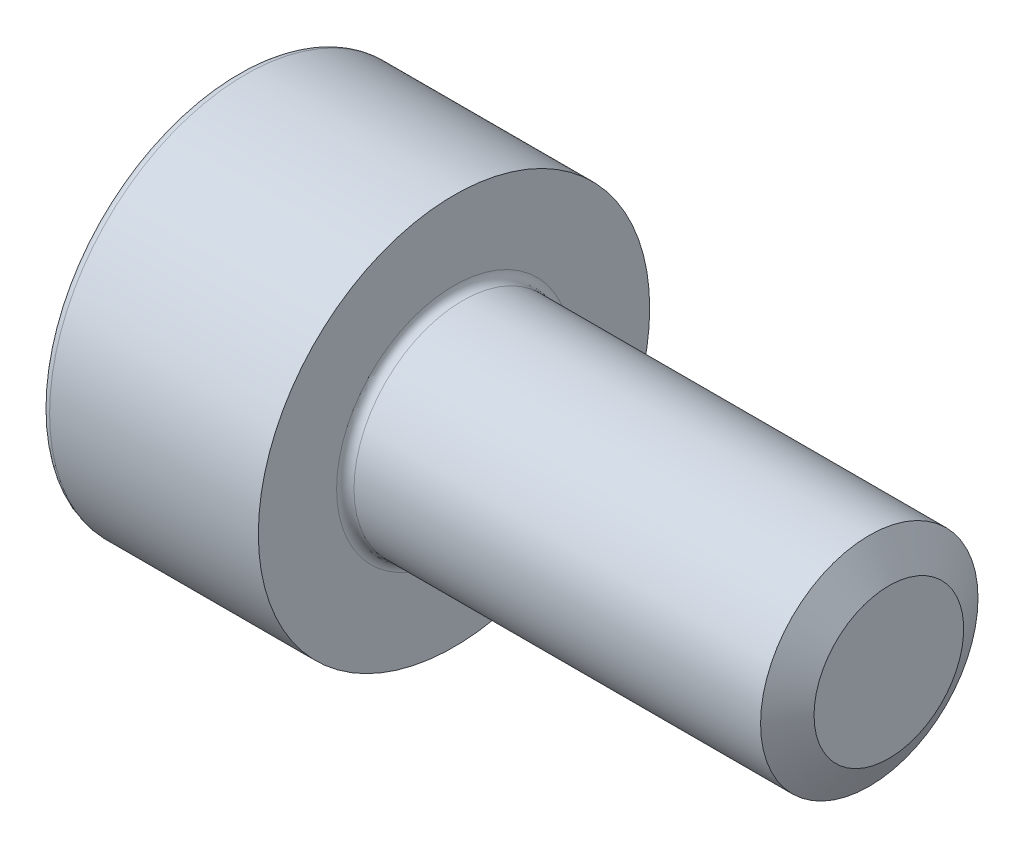
ISO-10303-21;
HEADER;
FILE_DESCRIPTION(('STEP AP214'),'2;1');
FILE_NAME('part.step','',(''),(''),'','','');
FILE_SCHEMA(('AUTOMOTIVE_DESIGN { 1 0 10303 214 1 1 1 1 }'));
ENDSEC;
DATA;
#1=APPLICATION_CONTEXT('core data for automotive mechanical design processes');
#2=APPLICATION_PROTOCOL_DEFINITION('international standard','automotive_design',2000,#1);
#3=PRODUCT_CONTEXT('',#1,'mechanical');
#4=PRODUCT('Part','Part','',(#3));
#5=PRODUCT_RELATED_PRODUCT_CATEGORY('part','',(#4));
#6=PRODUCT_DEFINITION_FORMATION('','',#4);
#7=PRODUCT_DEFINITION_CONTEXT('part definition',#1,'design');
#8=PRODUCT_DEFINITION('design','',#6,#7);
#9=PRODUCT_DEFINITION_SHAPE('','',#8);
#10=(LENGTH_UNIT() NAMED_UNIT(*) SI_UNIT(.MILLI.,.METRE.));
#11=(NAMED_UNIT(*) PLANE_ANGLE_UNIT() SI_UNIT($,.RADIAN.));
#12=(NAMED_UNIT(*) SI_UNIT($,.STERADIAN.) SOLID_ANGLE_UNIT());
#13=UNCERTAINTY_MEASURE_WITH_UNIT(LENGTH_MEASURE(1.E-05),#10,'distance_accuracy_value','');
#14=(GEOMETRIC_REPRESENTATION_CONTEXT(3) GLOBAL_UNCERTAINTY_ASSIGNED_CONTEXT((#13)) GLOBAL_UNIT_ASSIGNED_CONTEXT((#10,
#11,#12)) REPRESENTATION_CONTEXT('',''));
#15=CARTESIAN_POINT('',(0.,0.,0.));
#16=DIRECTION('',(0.,0.,1.));
#17=DIRECTION('',(1.,0.,0.));
#18=AXIS2_PLACEMENT_3D('',#15,#16,#17);
#19=CARTESIAN_POINT('',(0.,0.,0.));
#20=DIRECTION('',(1.,0.,0.));
#21=DIRECTION('',(0.,0.,-1.));
#22=AXIS2_PLACEMENT_3D('',#19,#20,#21);
#23=CYLINDRICAL_SURFACE('',#22,1.25);
#24=CARTESIAN_POINT('',(2.6,0.,0.));
#25=DIRECTION('',(1.,0.,0.));
#26=DIRECTION('',(0.,0.,-1.));
#27=AXIS2_PLACEMENT_3D('',#24,#25,#26);
#28=CIRCLE('',#27,1.25);
#29=CARTESIAN_POINT('',(2.6,0.,-1.25));
#30=VERTEX_POINT('',#29);
#31=EDGE_CURVE('E150',#30,#30,#28,.T.);
#32=ORIENTED_EDGE('',*,*,#31,.T.);
#33=EDGE_LOOP('',(#32));
#34=FACE_BOUND('',#33,.T.);
#35=CARTESIAN_POINT('',(7.275,0.,0.));
#36=DIRECTION('',(-1.,0.,0.));
#37=DIRECTION('',(0.,0.,1.));
#38=AXIS2_PLACEMENT_3D('',#35,#36,#37);
#39=CIRCLE('',#38,1.25);
#40=CARTESIAN_POINT('',(7.275,0.,1.25));
#41=VERTEX_POINT('',#40);
#42=EDGE_CURVE('E292',#41,#41,#39,.T.);
#43=ORIENTED_EDGE('',*,*,#42,.T.);
#44=EDGE_LOOP('',(#43));
#45=FACE_BOUND('',#44,.T.);
#46=ADVANCED_FACE('F47',(#34,#45),#23,.T.);
#47=CARTESIAN_POINT('',(0.,0.,0.));
#48=DIRECTION('',(-1.,0.,0.));
#49=DIRECTION('',(0.,0.,1.));
#50=AXIS2_PLACEMENT_3D('',#47,#48,#49);
#51=PLANE('',#50);
#52=CARTESIAN_POINT('',(0.,0.,0.));
#53=DIRECTION('',(-1.,0.,0.));
#54=DIRECTION('',(0.,0.,1.));
#55=AXIS2_PLACEMENT_3D('',#52,#53,#54);
#56=CIRCLE('',#55,2.15);
#57=CARTESIAN_POINT('',(0.,0.,2.15));
#58=VERTEX_POINT('',#57);
#59=EDGE_CURVE('E11',#58,#58,#56,.T.);
#60=ORIENTED_EDGE('',*,*,#59,.T.);
#61=EDGE_LOOP('',(#60));
#62=FACE_BOUND('',#61,.T.);
#63=DIRECTION('',(0.,0.5,0.866025403784439));
#64=VECTOR('',#63,1.);
#65=CARTESIAN_POINT('',(0.,-1.15,0.));
#66=LINE('',#65,#64);
#67=CARTESIAN_POINT('',(0.,-1.15,0.));
#68=VERTEX_POINT('',#67);
#69=CARTESIAN_POINT('',(0.,-0.575,0.995929214352104));
#70=VERTEX_POINT('',#69);
#71=EDGE_CURVE('E62',#68,#70,#66,.T.);
#72=ORIENTED_EDGE('',*,*,#71,.F.);
#73=DIRECTION('',(0.,-0.5,0.866025403784439));
#74=VECTOR('',#73,1.);
#75=CARTESIAN_POINT('',(0.,-0.575,-0.995929214352104));
#76=LINE('',#75,#74);
#77=CARTESIAN_POINT('',(0.,-0.575,-0.995929214352104));
#78=VERTEX_POINT('',#77);
#79=EDGE_CURVE('E146',#78,#68,#76,.T.);
#80=ORIENTED_EDGE('',*,*,#79,.F.);
#81=DIRECTION('',(0.,-1.,0.));
#82=VECTOR('',#81,1.);
#83=CARTESIAN_POINT('',(0.,0.575,-0.995929214352104));
#84=LINE('',#83,#82);
#85=CARTESIAN_POINT('',(0.,0.575,-0.995929214352104));
#86=VERTEX_POINT('',#85);
#87=EDGE_CURVE('E144',#86,#78,#84,.T.);
#88=ORIENTED_EDGE('',*,*,#87,.F.);
#89=DIRECTION('',(0.,-0.5,-0.866025403784439));
#90=VECTOR('',#89,1.);
#91=CARTESIAN_POINT('',(0.,1.15,0.));
#92=LINE('',#91,#90);
#93=CARTESIAN_POINT('',(0.,1.15,0.));
#94=VERTEX_POINT('',#93);
#95=EDGE_CURVE('E110',#94,#86,#92,.T.);
#96=ORIENTED_EDGE('',*,*,#95,.F.);
#97=DIRECTION('',(0.,0.5,-0.866025403784439));
#98=VECTOR('',#97,1.);
#99=CARTESIAN_POINT('',(0.,0.575,0.995929214352104));
#100=LINE('',#99,#98);
#101=CARTESIAN_POINT('',(0.,0.575,0.995929214352104));
#102=VERTEX_POINT('',#101);
#103=EDGE_CURVE('E140',#102,#94,#100,.T.);
#104=ORIENTED_EDGE('',*,*,#103,.F.);
#105=DIRECTION('',(0.,1.,0.));
#106=VECTOR('',#105,1.);
#107=CARTESIAN_POINT('',(0.,-0.575,0.995929214352104));
#108=LINE('',#107,#106);
#109=EDGE_CURVE('E136',#70,#102,#108,.T.);
#110=ORIENTED_EDGE('',*,*,#109,.F.);
#111=EDGE_LOOP('',(#72,#80,#88,#96,#104,#110));
#112=FACE_BOUND('',#111,.T.);
#113=ADVANCED_FACE('F186',(#62,#112),#51,.T.);
#114=CARTESIAN_POINT('',(0.,0.,0.));
#115=DIRECTION('',(1.,0.,0.));
#116=DIRECTION('',(0.,0.,-1.));
#117=AXIS2_PLACEMENT_3D('',#114,#115,#116);
#118=CYLINDRICAL_SURFACE('',#117,2.25);
#119=CARTESIAN_POINT('',(0.1,0.,0.));
#120=DIRECTION('',(-1.,0.,0.));
#121=DIRECTION('',(0.,0.,1.));
#122=AXIS2_PLACEMENT_3D('',#119,#120,#121);
#123=CIRCLE('',#122,2.25);
#124=CARTESIAN_POINT('',(0.1,0.,2.25));
#125=VERTEX_POINT('',#124);
#126=EDGE_CURVE('E55',#125,#125,#123,.F.);
#127=ORIENTED_EDGE('',*,*,#126,.T.);
#128=EDGE_LOOP('',(#127));
#129=FACE_BOUND('',#128,.T.);
#130=CARTESIAN_POINT('',(2.5,0.,0.));
#131=DIRECTION('',(1.,0.,0.));
#132=DIRECTION('',(0.,0.,-1.));
#133=AXIS2_PLACEMENT_3D('',#130,#131,#132);
#134=CIRCLE('',#133,2.25);
#135=CARTESIAN_POINT('',(2.5,0.,-2.25));
#136=VERTEX_POINT('',#135);
#137=EDGE_CURVE('E161',#136,#136,#134,.T.);
#138=ORIENTED_EDGE('',*,*,#137,.F.);
#139=EDGE_LOOP('',(#138));
#140=FACE_BOUND('',#139,.T.);
#141=ADVANCED_FACE('F167',(#129,#140),#118,.T.);
#142=CARTESIAN_POINT('',(2.5,2.25,0.));
#143=DIRECTION('',(1.,0.,0.));
#144=DIRECTION('',(0.,0.,-1.));
#145=AXIS2_PLACEMENT_3D('',#142,#143,#144);
#146=PLANE('',#145);
#147=ORIENTED_EDGE('',*,*,#137,.T.);
#148=EDGE_LOOP('',(#147));
#149=FACE_BOUND('',#148,.T.);
#150=CARTESIAN_POINT('',(2.5,0.,0.));
#151=DIRECTION('',(1.,0.,0.));
#152=DIRECTION('',(0.,0.,-1.));
#153=AXIS2_PLACEMENT_3D('',#150,#151,#152);
#154=CIRCLE('',#153,1.35);
#155=CARTESIAN_POINT('',(2.5,0.,-1.35));
#156=VERTEX_POINT('',#155);
#157=EDGE_CURVE('E158',#156,#156,#154,.T.);
#158=ORIENTED_EDGE('',*,*,#157,.F.);
#159=EDGE_LOOP('',(#158));
#160=FACE_BOUND('',#159,.T.);
#161=ADVANCED_FACE('F201',(#149,#160),#146,.T.);
#162=CARTESIAN_POINT('',(2.6,0.,0.));
#163=DIRECTION('',(1.,0.,0.));
#164=DIRECTION('',(0.,0.,-1.));
#165=AXIS2_PLACEMENT_3D('',#162,#163,#164);
#166=TOROIDAL_SURFACE('',#165,1.35,0.0999999999999997);
#167=ORIENTED_EDGE('',*,*,#157,.T.);
#168=EDGE_LOOP('',(#167));
#169=FACE_BOUND('',#168,.T.);
#170=ORIENTED_EDGE('',*,*,#31,.F.);
#171=EDGE_LOOP('',(#170));
#172=FACE_BOUND('',#171,.T.);
#173=ADVANCED_FACE('F197',(#169,#172),#166,.F.);
#174=CARTESIAN_POINT('',(1.1,-1.15,0.));
#175=DIRECTION('',(0.,-0.866025403784439,0.5));
#176=DIRECTION('',(0.,-0.5,-0.866025403784439));
#177=AXIS2_PLACEMENT_3D('',#174,#175,#176);
#178=PLANE('',#177);
#179=ORIENTED_EDGE('',*,*,#71,.T.);
#180=DIRECTION('',(-1.,0.,0.));
#181=VECTOR('',#180,1.);
#182=CARTESIAN_POINT('',(1.1,-0.575,0.995929214352104));
#183=LINE('',#182,#181);
#184=CARTESIAN_POINT('',(1.1,-0.575,0.995929214352104));
#185=VERTEX_POINT('',#184);
#186=EDGE_CURVE('E92',#185,#70,#183,.T.);
#187=ORIENTED_EDGE('',*,*,#186,.F.);
#188=DIRECTION('',(0.,0.5,0.866025403784439));
#189=VECTOR('',#188,1.);
#190=CARTESIAN_POINT('',(1.1,-1.15,0.));
#191=LINE('',#190,#189);
#192=CARTESIAN_POINT('',(1.1,-1.15,0.));
#193=VERTEX_POINT('',#192);
#194=EDGE_CURVE('E148',#193,#185,#191,.T.);
#195=ORIENTED_EDGE('',*,*,#194,.F.);
#196=DIRECTION('',(-1.,0.,0.));
#197=VECTOR('',#196,1.);
#198=CARTESIAN_POINT('',(1.1,-1.15,0.));
#199=LINE('',#198,#197);
#200=EDGE_CURVE('E70',#193,#68,#199,.T.);
#201=ORIENTED_EDGE('',*,*,#200,.T.);
#202=EDGE_LOOP('',(#179,#187,#195,#201));
#203=FACE_BOUND('',#202,.T.);
#204=ADVANCED_FACE('F200',(#203),#178,.F.);
#205=CARTESIAN_POINT('',(1.1,-0.575,-0.995929214352104));
#206=DIRECTION('',(0.,-0.866025403784439,-0.5));
#207=DIRECTION('',(0.,0.5,-0.866025403784439));
#208=AXIS2_PLACEMENT_3D('',#205,#206,#207);
#209=PLANE('',#208);
#210=ORIENTED_EDGE('',*,*,#79,.T.);
#211=ORIENTED_EDGE('',*,*,#200,.F.);
#212=DIRECTION('',(0.,-0.5,0.866025403784439));
#213=VECTOR('',#212,1.);
#214=CARTESIAN_POINT('',(1.1,-0.575,-0.995929214352104));
#215=LINE('',#214,#213);
#216=CARTESIAN_POINT('',(1.1,-0.575,-0.995929214352104));
#217=VERTEX_POINT('',#216);
#218=EDGE_CURVE('E122',#217,#193,#215,.T.);
#219=ORIENTED_EDGE('',*,*,#218,.F.);
#220=DIRECTION('',(-1.,0.,0.));
#221=VECTOR('',#220,1.);
#222=CARTESIAN_POINT('',(1.1,-0.575,-0.995929214352104));
#223=LINE('',#222,#221);
#224=EDGE_CURVE('E114',#217,#78,#223,.T.);
#225=ORIENTED_EDGE('',*,*,#224,.T.);
#226=EDGE_LOOP('',(#210,#211,#219,#225));
#227=FACE_BOUND('',#226,.T.);
#228=ADVANCED_FACE('F250',(#227),#209,.F.);
#229=CARTESIAN_POINT('',(1.1,0.575,-0.995929214352104));
#230=DIRECTION('',(0.,0.,-1.));
#231=DIRECTION('',(-1.,0.,0.));
#232=AXIS2_PLACEMENT_3D('',#229,#230,#231);
#233=PLANE('',#232);
#234=ORIENTED_EDGE('',*,*,#87,.T.);
#235=ORIENTED_EDGE('',*,*,#224,.F.);
#236=DIRECTION('',(0.,-1.,0.));
#237=VECTOR('',#236,1.);
#238=CARTESIAN_POINT('',(1.1,0.575,-0.995929214352104));
#239=LINE('',#238,#237);
#240=CARTESIAN_POINT('',(1.1,0.575,-0.995929214352104));
#241=VERTEX_POINT('',#240);
#242=EDGE_CURVE('E118',#241,#217,#239,.T.);
#243=ORIENTED_EDGE('',*,*,#242,.F.);
#244=DIRECTION('',(-1.,0.,0.));
#245=VECTOR('',#244,1.);
#246=CARTESIAN_POINT('',(1.1,0.575,-0.995929214352104));
#247=LINE('',#246,#245);
#248=EDGE_CURVE('E103',#241,#86,#247,.T.);
#249=ORIENTED_EDGE('',*,*,#248,.T.);
#250=EDGE_LOOP('',(#234,#235,#243,#249));
#251=FACE_BOUND('',#250,.T.);
#252=ADVANCED_FACE('F119',(#251),#233,.F.);
#253=CARTESIAN_POINT('',(1.1,1.15,0.));
#254=DIRECTION('',(0.,0.866025403784439,-0.5));
#255=DIRECTION('',(0.,0.5,0.866025403784439));
#256=AXIS2_PLACEMENT_3D('',#253,#254,#255);
#257=PLANE('',#256);
#258=ORIENTED_EDGE('',*,*,#95,.T.);
#259=ORIENTED_EDGE('',*,*,#248,.F.);
#260=DIRECTION('',(0.,-0.5,-0.866025403784439));
#261=VECTOR('',#260,1.);
#262=CARTESIAN_POINT('',(1.1,1.15,0.));
#263=LINE('',#262,#261);
#264=CARTESIAN_POINT('',(1.1,1.15,0.));
#265=VERTEX_POINT('',#264);
#266=EDGE_CURVE('E107',#265,#241,#263,.T.);
#267=ORIENTED_EDGE('',*,*,#266,.F.);
#268=DIRECTION('',(-1.,0.,0.));
#269=VECTOR('',#268,1.);
#270=CARTESIAN_POINT('',(1.1,1.15,0.));
#271=LINE('',#270,#269);
#272=EDGE_CURVE('E115',#265,#94,#271,.T.);
#273=ORIENTED_EDGE('',*,*,#272,.T.);
#274=EDGE_LOOP('',(#258,#259,#267,#273));
#275=FACE_BOUND('',#274,.T.);
#276=ADVANCED_FACE('F105',(#275),#257,.F.);
#277=CARTESIAN_POINT('',(1.1,0.575,0.995929214352104));
#278=DIRECTION('',(0.,0.866025403784439,0.5));
#279=DIRECTION('',(0.,-0.5,0.866025403784439));
#280=AXIS2_PLACEMENT_3D('',#277,#278,#279);
#281=PLANE('',#280);
#282=ORIENTED_EDGE('',*,*,#103,.T.);
#283=ORIENTED_EDGE('',*,*,#272,.F.);
#284=DIRECTION('',(0.,0.5,-0.866025403784439));
#285=VECTOR('',#284,1.);
#286=CARTESIAN_POINT('',(1.1,0.575,0.995929214352104));
#287=LINE('',#286,#285);
#288=CARTESIAN_POINT('',(1.1,0.575,0.995929214352104));
#289=VERTEX_POINT('',#288);
#290=EDGE_CURVE('E128',#289,#265,#287,.T.);
#291=ORIENTED_EDGE('',*,*,#290,.F.);
#292=DIRECTION('',(-1.,0.,0.));
#293=VECTOR('',#292,1.);
#294=CARTESIAN_POINT('',(1.1,0.575,0.995929214352104));
#295=LINE('',#294,#293);
#296=EDGE_CURVE('E153',#289,#102,#295,.T.);
#297=ORIENTED_EDGE('',*,*,#296,.T.);
#298=EDGE_LOOP('',(#282,#283,#291,#297));
#299=FACE_BOUND('',#298,.T.);
#300=ADVANCED_FACE('F226',(#299),#281,.F.);
#301=CARTESIAN_POINT('',(1.1,-0.575,0.995929214352104));
#302=DIRECTION('',(0.,0.,1.));
#303=DIRECTION('',(0.,-1.,0.));
#304=AXIS2_PLACEMENT_3D('',#301,#302,#303);
#305=PLANE('',#304);
#306=ORIENTED_EDGE('',*,*,#109,.T.);
#307=ORIENTED_EDGE('',*,*,#296,.F.);
#308=DIRECTION('',(0.,1.,0.));
#309=VECTOR('',#308,1.);
#310=CARTESIAN_POINT('',(1.1,-0.575,0.995929214352104));
#311=LINE('',#310,#309);
#312=EDGE_CURVE('E130',#185,#289,#311,.T.);
#313=ORIENTED_EDGE('',*,*,#312,.F.);
#314=ORIENTED_EDGE('',*,*,#186,.T.);
#315=EDGE_LOOP('',(#306,#307,#313,#314));
#316=FACE_BOUND('',#315,.T.);
#317=ADVANCED_FACE('F182',(#316),#305,.F.);
#318=CARTESIAN_POINT('',(1.1,-0.575,0.995929214352104));
#319=DIRECTION('',(-1.,0.,0.));
#320=DIRECTION('',(0.,0.,1.));
#321=AXIS2_PLACEMENT_3D('',#318,#319,#320);
#322=PLANE('',#321);
#323=ORIENTED_EDGE('',*,*,#194,.T.);
#324=ORIENTED_EDGE('',*,*,#312,.T.);
#325=ORIENTED_EDGE('',*,*,#290,.T.);
#326=ORIENTED_EDGE('',*,*,#266,.T.);
#327=ORIENTED_EDGE('',*,*,#242,.T.);
#328=ORIENTED_EDGE('',*,*,#218,.T.);
#329=EDGE_LOOP('',(#323,#324,#325,#326,#327,#328));
#330=FACE_BOUND('',#329,.T.);
#331=ADVANCED_FACE('F125',(#330),#322,.T.);
#332=CARTESIAN_POINT('',(0.1,0.,0.));
#333=DIRECTION('',(-1.,0.,0.));
#334=DIRECTION('',(0.,0.,1.));
#335=AXIS2_PLACEMENT_3D('',#332,#333,#334);
#336=TOROIDAL_SURFACE('',#335,2.15,0.1);
#337=ORIENTED_EDGE('',*,*,#59,.F.);
#338=EDGE_LOOP('',(#337));
#339=FACE_BOUND('',#338,.T.);
#340=ORIENTED_EDGE('',*,*,#126,.F.);
#341=EDGE_LOOP('',(#340));
#342=FACE_BOUND('',#341,.T.);
#343=ADVANCED_FACE('F49',(#339,#342),#336,.T.);
#344=CARTESIAN_POINT('',(7.275,0.,0.));
#345=DIRECTION('',(-1.,0.,0.));
#346=DIRECTION('',(0.,0.,1.));
#347=AXIS2_PLACEMENT_3D('',#344,#345,#346);
#348=CONICAL_SURFACE('',#347,1.25,1.04718484902493);
#349=CARTESIAN_POINT('',(7.5,0.,0.));
#350=DIRECTION('',(-1.,0.,0.));
#351=DIRECTION('',(0.,0.,1.));
#352=AXIS2_PLACEMENT_3D('',#349,#350,#351);
#353=CIRCLE('',#352,0.8603);
#354=CARTESIAN_POINT('',(7.5,0.,0.8603));
#355=VERTEX_POINT('',#354);
#356=EDGE_CURVE('E137',#355,#355,#353,.T.);
#357=ORIENTED_EDGE('',*,*,#356,.T.);
#358=EDGE_LOOP('',(#357));
#359=FACE_BOUND('',#358,.T.);
#360=ORIENTED_EDGE('',*,*,#42,.F.);
#361=EDGE_LOOP('',(#360));
#362=FACE_BOUND('',#361,.T.);
#363=ADVANCED_FACE('F171',(#359,#362),#348,.T.);
#364=CARTESIAN_POINT('',(7.5,1.25,0.));
#365=DIRECTION('',(1.,0.,0.));
#366=DIRECTION('',(0.,0.,-1.));
#367=AXIS2_PLACEMENT_3D('',#364,#365,#366);
#368=PLANE('',#367);
#369=ORIENTED_EDGE('',*,*,#356,.F.);
#370=EDGE_LOOP('',(#369));
#371=FACE_BOUND('',#370,.T.);
#372=ADVANCED_FACE('F178',(#371),#368,.T.);
#373=CLOSED_SHELL('',(#46,#113,#141,#161,#173,#204,#228,#252,#276,#300,#317,#331,#343,#363,#372));
#374=MANIFOLD_SOLID_BREP('B2',#373);
#375=ADVANCED_BREP_SHAPE_REPRESENTATION('',(#18,#374),#14);
#376=SHAPE_DEFINITION_REPRESENTATION(#9,#375);
ENDSEC;
END-ISO-10303-21;
